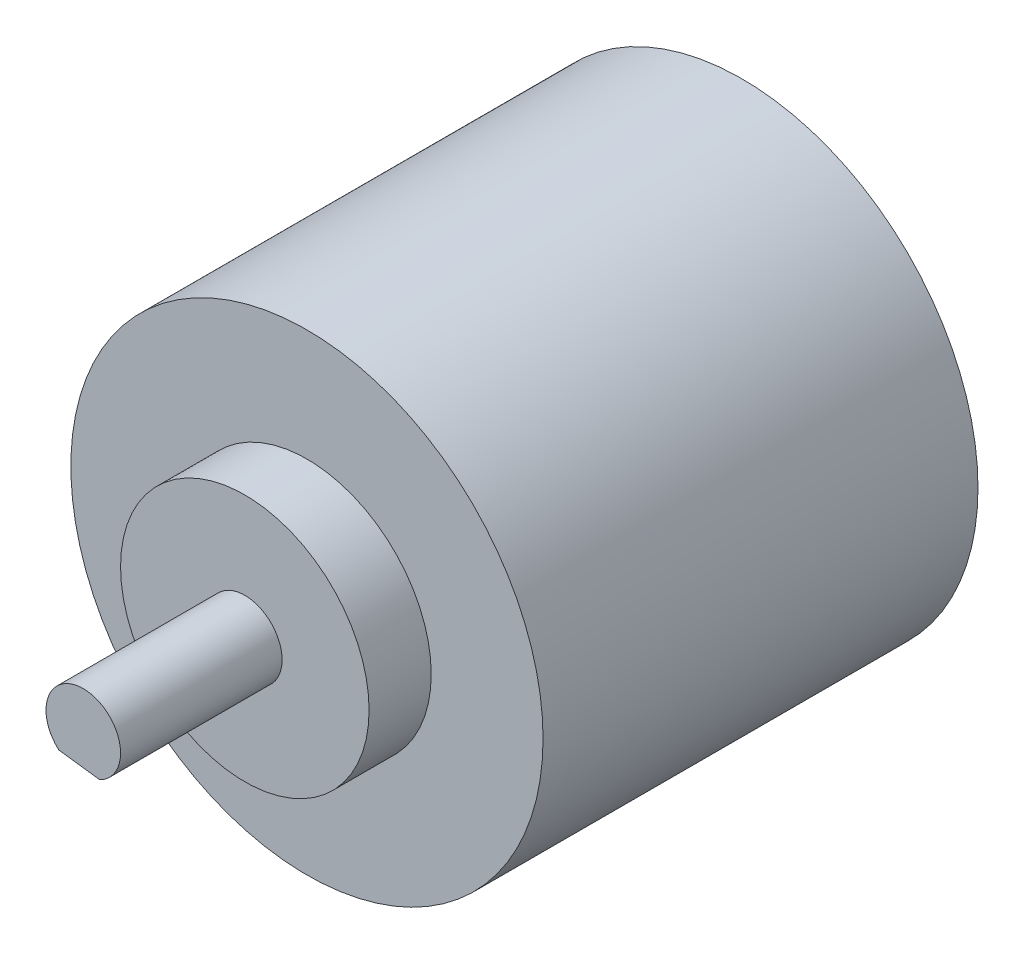
ISO-10303-21;
HEADER;
FILE_DESCRIPTION(('STEP AP214'),'2;1');
FILE_NAME('part.step','',(''),(''),'','','');
FILE_SCHEMA(('AUTOMOTIVE_DESIGN { 1 0 10303 214 1 1 1 1 }'));
ENDSEC;
DATA;
#1=APPLICATION_CONTEXT('core data for automotive mechanical design processes');
#2=APPLICATION_PROTOCOL_DEFINITION('international standard','automotive_design',2000,#1);
#3=PRODUCT_CONTEXT('',#1,'mechanical');
#4=PRODUCT('Part','Part','',(#3));
#5=PRODUCT_RELATED_PRODUCT_CATEGORY('part','',(#4));
#6=PRODUCT_DEFINITION_FORMATION('','',#4);
#7=PRODUCT_DEFINITION_CONTEXT('part definition',#1,'design');
#8=PRODUCT_DEFINITION('design','',#6,#7);
#9=PRODUCT_DEFINITION_SHAPE('','',#8);
#10=(LENGTH_UNIT() NAMED_UNIT(*) SI_UNIT(.MILLI.,.METRE.));
#11=(NAMED_UNIT(*) PLANE_ANGLE_UNIT() SI_UNIT($,.RADIAN.));
#12=(NAMED_UNIT(*) SI_UNIT($,.STERADIAN.) SOLID_ANGLE_UNIT());
#13=UNCERTAINTY_MEASURE_WITH_UNIT(LENGTH_MEASURE(1.E-05),#10,'distance_accuracy_value','');
#14=(GEOMETRIC_REPRESENTATION_CONTEXT(3) GLOBAL_UNCERTAINTY_ASSIGNED_CONTEXT((#13)) GLOBAL_UNIT_ASSIGNED_CONTEXT((#10,
#11,#12)) REPRESENTATION_CONTEXT('',''));
#15=CARTESIAN_POINT('',(0.,0.,0.));
#16=DIRECTION('',(0.,0.,1.));
#17=DIRECTION('',(1.,0.,0.));
#18=AXIS2_PLACEMENT_3D('',#15,#16,#17);
#19=CARTESIAN_POINT('',(0.,0.,35.));
#20=DIRECTION('',(0.,0.,-1.));
#21=DIRECTION('',(-1.,0.,0.));
#22=AXIS2_PLACEMENT_3D('',#19,#20,#21);
#23=CYLINDRICAL_SURFACE('',#22,19.);
#24=CARTESIAN_POINT('',(0.,0.,35.));
#25=DIRECTION('',(0.,0.,1.));
#26=DIRECTION('',(1.,0.,0.));
#27=AXIS2_PLACEMENT_3D('',#24,#25,#26);
#28=CIRCLE('',#27,19.);
#29=CARTESIAN_POINT('',(19.,0.,35.));
#30=VERTEX_POINT('',#29);
#31=EDGE_CURVE('E11',#30,#30,#28,.T.);
#32=ORIENTED_EDGE('',*,*,#31,.F.);
#33=EDGE_LOOP('',(#32));
#34=FACE_BOUND('',#33,.T.);
#35=CARTESIAN_POINT('',(0.,0.,0.));
#36=DIRECTION('',(0.,0.,1.));
#37=DIRECTION('',(1.,0.,0.));
#38=AXIS2_PLACEMENT_3D('',#35,#36,#37);
#39=CIRCLE('',#38,19.);
#40=CARTESIAN_POINT('',(19.,0.,0.));
#41=VERTEX_POINT('',#40);
#42=EDGE_CURVE('E40',#41,#41,#39,.T.);
#43=ORIENTED_EDGE('',*,*,#42,.T.);
#44=EDGE_LOOP('',(#43));
#45=FACE_BOUND('',#44,.T.);
#46=ADVANCED_FACE('F37',(#34,#45),#23,.T.);
#47=CARTESIAN_POINT('',(0.,0.,35.));
#48=DIRECTION('',(0.,0.,1.));
#49=DIRECTION('',(1.,0.,0.));
#50=AXIS2_PLACEMENT_3D('',#47,#48,#49);
#51=PLANE('',#50);
#52=CARTESIAN_POINT('',(0.,0.,35.));
#53=DIRECTION('',(0.,0.,1.));
#54=DIRECTION('',(1.,0.,0.));
#55=AXIS2_PLACEMENT_3D('',#52,#53,#54);
#56=CIRCLE('',#55,10.);
#57=CARTESIAN_POINT('',(10.,0.,35.));
#58=VERTEX_POINT('',#57);
#59=EDGE_CURVE('E76',#58,#58,#56,.T.);
#60=ORIENTED_EDGE('',*,*,#59,.F.);
#61=EDGE_LOOP('',(#60));
#62=FACE_BOUND('',#61,.T.);
#63=ORIENTED_EDGE('',*,*,#31,.T.);
#64=EDGE_LOOP('',(#63));
#65=FACE_BOUND('',#64,.T.);
#66=ADVANCED_FACE('F94',(#62,#65),#51,.T.);
#67=CARTESIAN_POINT('',(0.,0.,0.));
#68=DIRECTION('',(0.,0.,1.));
#69=DIRECTION('',(1.,0.,0.));
#70=AXIS2_PLACEMENT_3D('',#67,#68,#69);
#71=PLANE('',#70);
#72=ORIENTED_EDGE('',*,*,#42,.F.);
#73=EDGE_LOOP('',(#72));
#74=FACE_BOUND('',#73,.T.);
#75=ADVANCED_FACE('F91',(#74),#71,.F.);
#76=CARTESIAN_POINT('',(0.,0.,40.));
#77=DIRECTION('',(0.,0.,-1.));
#78=DIRECTION('',(-1.,0.,0.));
#79=AXIS2_PLACEMENT_3D('',#76,#77,#78);
#80=CYLINDRICAL_SURFACE('',#79,10.);
#81=CARTESIAN_POINT('',(0.,0.,40.));
#82=DIRECTION('',(0.,0.,1.));
#83=DIRECTION('',(1.,0.,0.));
#84=AXIS2_PLACEMENT_3D('',#81,#82,#83);
#85=CIRCLE('',#84,10.);
#86=CARTESIAN_POINT('',(10.,0.,40.));
#87=VERTEX_POINT('',#86);
#88=EDGE_CURVE('E79',#87,#87,#85,.T.);
#89=ORIENTED_EDGE('',*,*,#88,.F.);
#90=EDGE_LOOP('',(#89));
#91=FACE_BOUND('',#90,.T.);
#92=ORIENTED_EDGE('',*,*,#59,.T.);
#93=EDGE_LOOP('',(#92));
#94=FACE_BOUND('',#93,.T.);
#95=ADVANCED_FACE('F93',(#91,#94),#80,.T.);
#96=CARTESIAN_POINT('',(0.,0.,40.));
#97=DIRECTION('',(0.,0.,1.));
#98=DIRECTION('',(1.,0.,0.));
#99=AXIS2_PLACEMENT_3D('',#96,#97,#98);
#100=PLANE('',#99);
#101=CARTESIAN_POINT('',(0.,0.,40.));
#102=DIRECTION('',(0.,0.,1.));
#103=DIRECTION('',(1.,0.,0.));
#104=AXIS2_PLACEMENT_3D('',#101,#102,#103);
#105=CIRCLE('',#104,3.);
#106=CARTESIAN_POINT('',(1.32183678858681,-2.69309255398668,40.));
#107=VERTEX_POINT('',#106);
#108=CARTESIAN_POINT('',(-1.96705722868118,-2.26510173261448,40.));
#109=VERTEX_POINT('',#108);
#110=EDGE_CURVE('E73',#107,#109,#105,.T.);
#111=ORIENTED_EDGE('',*,*,#110,.F.);
#112=DIRECTION('',(-0.991638857320233,0.129044088018874,0.));
#113=VECTOR('',#112,1.);
#114=CARTESIAN_POINT('',(-1.96705722868118,-2.26510173261448,40.));
#115=LINE('',#114,#113);
#116=EDGE_CURVE('E66',#107,#109,#115,.T.);
#117=ORIENTED_EDGE('',*,*,#116,.T.);
#118=EDGE_LOOP('',(#111,#117));
#119=FACE_BOUND('',#118,.T.);
#120=ORIENTED_EDGE('',*,*,#88,.T.);
#121=EDGE_LOOP('',(#120));
#122=FACE_BOUND('',#121,.T.);
#123=ADVANCED_FACE('F99',(#119,#122),#100,.T.);
#124=CARTESIAN_POINT('',(0.,0.,53.));
#125=DIRECTION('',(0.,0.,-1.));
#126=DIRECTION('',(-1.,0.,0.));
#127=AXIS2_PLACEMENT_3D('',#124,#125,#126);
#128=CYLINDRICAL_SURFACE('',#127,3.);
#129=CARTESIAN_POINT('',(0.,0.,53.));
#130=DIRECTION('',(0.,0.,1.));
#131=DIRECTION('',(1.,0.,0.));
#132=AXIS2_PLACEMENT_3D('',#129,#130,#131);
#133=CIRCLE('',#132,3.);
#134=CARTESIAN_POINT('',(1.32183678858681,-2.69309255398668,53.));
#135=VERTEX_POINT('',#134);
#136=CARTESIAN_POINT('',(-1.96705722868118,-2.26510173261448,53.));
#137=VERTEX_POINT('',#136);
#138=EDGE_CURVE('E71',#135,#137,#133,.T.);
#139=ORIENTED_EDGE('',*,*,#138,.F.);
#140=DIRECTION('',(0.,0.,1.));
#141=VECTOR('',#140,1.);
#142=CARTESIAN_POINT('',(1.32183678858681,-2.69309255398668,40.));
#143=LINE('',#142,#141);
#144=EDGE_CURVE('E51',#107,#135,#143,.T.);
#145=ORIENTED_EDGE('',*,*,#144,.F.);
#146=ORIENTED_EDGE('',*,*,#110,.T.);
#147=DIRECTION('',(0.,0.,1.));
#148=VECTOR('',#147,1.);
#149=CARTESIAN_POINT('',(-1.96705722868118,-2.26510173261448,40.));
#150=LINE('',#149,#148);
#151=EDGE_CURVE('E57',#109,#137,#150,.T.);
#152=ORIENTED_EDGE('',*,*,#151,.T.);
#153=EDGE_LOOP('',(#139,#145,#146,#152));
#154=FACE_BOUND('',#153,.T.);
#155=ADVANCED_FACE('F70',(#154),#128,.T.);
#156=CARTESIAN_POINT('',(0.,0.,53.));
#157=DIRECTION('',(0.,0.,1.));
#158=DIRECTION('',(1.,0.,0.));
#159=AXIS2_PLACEMENT_3D('',#156,#157,#158);
#160=PLANE('',#159);
#161=DIRECTION('',(-0.991638857320233,0.129044088018874,0.));
#162=VECTOR('',#161,1.);
#163=CARTESIAN_POINT('',(-1.96705722868118,-2.26510173261448,53.));
#164=LINE('',#163,#162);
#165=EDGE_CURVE('E61',#135,#137,#164,.T.);
#166=ORIENTED_EDGE('',*,*,#165,.F.);
#167=ORIENTED_EDGE('',*,*,#138,.T.);
#168=EDGE_LOOP('',(#166,#167));
#169=FACE_BOUND('',#168,.T.);
#170=ADVANCED_FACE('F75',(#169),#160,.T.);
#171=CARTESIAN_POINT('',(-1.96705722868118,-2.26510173261448,40.));
#172=DIRECTION('',(0.129044088018874,0.991638857320233,0.));
#173=DIRECTION('',(-0.991638857320233,0.129044088018874,0.));
#174=AXIS2_PLACEMENT_3D('',#171,#172,#173);
#175=PLANE('',#174);
#176=ORIENTED_EDGE('',*,*,#165,.T.);
#177=ORIENTED_EDGE('',*,*,#151,.F.);
#178=ORIENTED_EDGE('',*,*,#116,.F.);
#179=ORIENTED_EDGE('',*,*,#144,.T.);
#180=EDGE_LOOP('',(#176,#177,#178,#179));
#181=FACE_BOUND('',#180,.T.);
#182=ADVANCED_FACE('F62',(#181),#175,.F.);
#183=CLOSED_SHELL('',(#46,#66,#75,#95,#123,#155,#170,#182));
#184=MANIFOLD_SOLID_BREP('B2',#183);
#185=ADVANCED_BREP_SHAPE_REPRESENTATION('',(#18,#184),#14);
#186=SHAPE_DEFINITION_REPRESENTATION(#9,#185);
ENDSEC;
END-ISO-10303-21;
